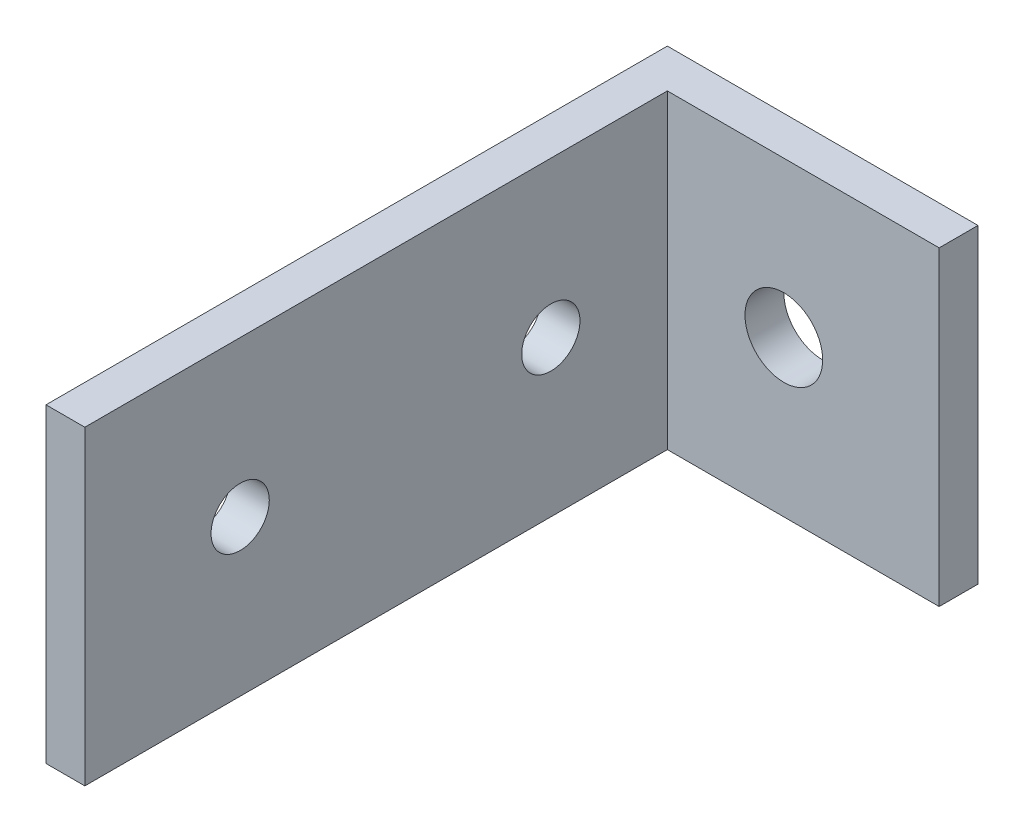
ISO-10303-21;
HEADER;
FILE_DESCRIPTION(('STEP AP214'),'2;1');
FILE_NAME('part.step','',(''),(''),'','','');
FILE_SCHEMA(('AUTOMOTIVE_DESIGN { 1 0 10303 214 1 1 1 1 }'));
ENDSEC;
DATA;
#1=APPLICATION_CONTEXT('core data for automotive mechanical design processes');
#2=APPLICATION_PROTOCOL_DEFINITION('international standard','automotive_design',2000,#1);
#3=PRODUCT_CONTEXT('',#1,'mechanical');
#4=PRODUCT('Part','Part','',(#3));
#5=PRODUCT_RELATED_PRODUCT_CATEGORY('part','',(#4));
#6=PRODUCT_DEFINITION_FORMATION('','',#4);
#7=PRODUCT_DEFINITION_CONTEXT('part definition',#1,'design');
#8=PRODUCT_DEFINITION('design','',#6,#7);
#9=PRODUCT_DEFINITION_SHAPE('','',#8);
#10=(LENGTH_UNIT() NAMED_UNIT(*) SI_UNIT(.MILLI.,.METRE.));
#11=(NAMED_UNIT(*) PLANE_ANGLE_UNIT() SI_UNIT($,.RADIAN.));
#12=(NAMED_UNIT(*) SI_UNIT($,.STERADIAN.) SOLID_ANGLE_UNIT());
#13=UNCERTAINTY_MEASURE_WITH_UNIT(LENGTH_MEASURE(1.E-05),#10,'distance_accuracy_value','');
#14=(GEOMETRIC_REPRESENTATION_CONTEXT(3) GLOBAL_UNCERTAINTY_ASSIGNED_CONTEXT((#13)) GLOBAL_UNIT_ASSIGNED_CONTEXT((#10,
#11,#12)) REPRESENTATION_CONTEXT('',''));
#15=CARTESIAN_POINT('',(0.,0.,0.));
#16=DIRECTION('',(0.,0.,1.));
#17=DIRECTION('',(1.,0.,0.));
#18=AXIS2_PLACEMENT_3D('',#15,#16,#17);
#19=CARTESIAN_POINT('',(22.225,25.4,0.));
#20=DIRECTION('',(-1.,0.,0.));
#21=DIRECTION('',(0.,0.,-1.));
#22=AXIS2_PLACEMENT_3D('',#19,#20,#21);
#23=PLANE('',#22);
#24=DIRECTION('',(0.,0.,1.));
#25=VECTOR('',#24,1.);
#26=CARTESIAN_POINT('',(22.225,0.,0.));
#27=LINE('',#26,#25);
#28=CARTESIAN_POINT('',(22.225,0.,-3.175));
#29=VERTEX_POINT('',#28);
#30=CARTESIAN_POINT('',(22.225,0.,0.));
#31=VERTEX_POINT('',#30);
#32=EDGE_CURVE('E120',#29,#31,#27,.T.);
#33=ORIENTED_EDGE('',*,*,#32,.F.);
#34=DIRECTION('',(0.,-1.,0.));
#35=VECTOR('',#34,1.);
#36=CARTESIAN_POINT('',(22.225,25.4,-3.175));
#37=LINE('',#36,#35);
#38=CARTESIAN_POINT('',(22.225,25.4,-3.175));
#39=VERTEX_POINT('',#38);
#40=EDGE_CURVE('E11',#39,#29,#37,.T.);
#41=ORIENTED_EDGE('',*,*,#40,.F.);
#42=DIRECTION('',(0.,0.,1.));
#43=VECTOR('',#42,1.);
#44=CARTESIAN_POINT('',(22.225,25.4,0.));
#45=LINE('',#44,#43);
#46=CARTESIAN_POINT('',(22.225,25.4,0.));
#47=VERTEX_POINT('',#46);
#48=EDGE_CURVE('E114',#39,#47,#45,.T.);
#49=ORIENTED_EDGE('',*,*,#48,.T.);
#50=DIRECTION('',(0.,-1.,0.));
#51=VECTOR('',#50,1.);
#52=CARTESIAN_POINT('',(22.225,25.4,0.));
#53=LINE('',#52,#51);
#54=EDGE_CURVE('E43',#47,#31,#53,.T.);
#55=ORIENTED_EDGE('',*,*,#54,.T.);
#56=EDGE_LOOP('',(#33,#41,#49,#55));
#57=FACE_BOUND('',#56,.T.);
#58=ADVANCED_FACE('F35',(#57),#23,.F.);
#59=CARTESIAN_POINT('',(0.,25.4,0.));
#60=DIRECTION('',(0.,0.,-1.));
#61=DIRECTION('',(1.,0.,0.));
#62=AXIS2_PLACEMENT_3D('',#59,#60,#61);
#63=PLANE('',#62);
#64=CARTESIAN_POINT('',(9.525,12.7,0.));
#65=DIRECTION('',(0.,0.,-1.));
#66=DIRECTION('',(-1.,0.,0.));
#67=AXIS2_PLACEMENT_3D('',#64,#65,#66);
#68=CIRCLE('',#67,3.175);
#69=CARTESIAN_POINT('',(6.35,12.7,0.));
#70=VERTEX_POINT('',#69);
#71=EDGE_CURVE('E247',#70,#70,#68,.T.);
#72=ORIENTED_EDGE('',*,*,#71,.T.);
#73=EDGE_LOOP('',(#72));
#74=FACE_BOUND('',#73,.T.);
#75=DIRECTION('',(-1.,0.,0.));
#76=VECTOR('',#75,1.);
#77=CARTESIAN_POINT('',(0.,0.,0.));
#78=LINE('',#77,#76);
#79=CARTESIAN_POINT('',(0.,0.,0.));
#80=VERTEX_POINT('',#79);
#81=EDGE_CURVE('E123',#31,#80,#78,.T.);
#82=ORIENTED_EDGE('',*,*,#81,.F.);
#83=ORIENTED_EDGE('',*,*,#54,.F.);
#84=DIRECTION('',(-1.,0.,0.));
#85=VECTOR('',#84,1.);
#86=CARTESIAN_POINT('',(0.,25.4,0.));
#87=LINE('',#86,#85);
#88=CARTESIAN_POINT('',(0.,25.4,0.));
#89=VERTEX_POINT('',#88);
#90=EDGE_CURVE('E112',#47,#89,#87,.T.);
#91=ORIENTED_EDGE('',*,*,#90,.T.);
#92=DIRECTION('',(0.,-1.,0.));
#93=VECTOR('',#92,1.);
#94=CARTESIAN_POINT('',(0.,25.4,0.));
#95=LINE('',#94,#93);
#96=EDGE_CURVE('E106',#89,#80,#95,.T.);
#97=ORIENTED_EDGE('',*,*,#96,.T.);
#98=EDGE_LOOP('',(#82,#83,#91,#97));
#99=FACE_BOUND('',#98,.T.);
#100=ADVANCED_FACE('F158',(#74,#99),#63,.F.);
#101=CARTESIAN_POINT('',(0.,25.4,47.625));
#102=DIRECTION('',(-1.,0.,0.));
#103=DIRECTION('',(0.,0.,-1.));
#104=AXIS2_PLACEMENT_3D('',#101,#102,#103);
#105=PLANE('',#104);
#106=CARTESIAN_POINT('',(0.,12.7,34.925));
#107=DIRECTION('',(1.,0.,0.));
#108=DIRECTION('',(0.,0.,-1.));
#109=AXIS2_PLACEMENT_3D('',#106,#107,#108);
#110=CIRCLE('',#109,2.38125);
#111=CARTESIAN_POINT('',(0.,12.7,32.54375));
#112=VERTEX_POINT('',#111);
#113=EDGE_CURVE('E237',#112,#112,#110,.T.);
#114=ORIENTED_EDGE('',*,*,#113,.F.);
#115=EDGE_LOOP('',(#114));
#116=FACE_BOUND('',#115,.T.);
#117=CARTESIAN_POINT('',(0.,12.7,9.525));
#118=DIRECTION('',(1.,0.,0.));
#119=DIRECTION('',(0.,0.,-1.));
#120=AXIS2_PLACEMENT_3D('',#117,#118,#119);
#121=CIRCLE('',#120,2.38125);
#122=CARTESIAN_POINT('',(0.,12.7,7.14375));
#123=VERTEX_POINT('',#122);
#124=EDGE_CURVE('E241',#123,#123,#121,.T.);
#125=ORIENTED_EDGE('',*,*,#124,.F.);
#126=EDGE_LOOP('',(#125));
#127=FACE_BOUND('',#126,.T.);
#128=DIRECTION('',(0.,0.,1.));
#129=VECTOR('',#128,1.);
#130=CARTESIAN_POINT('',(0.,0.,47.625));
#131=LINE('',#130,#129);
#132=CARTESIAN_POINT('',(0.,0.,47.625));
#133=VERTEX_POINT('',#132);
#134=EDGE_CURVE('E127',#80,#133,#131,.T.);
#135=ORIENTED_EDGE('',*,*,#134,.F.);
#136=ORIENTED_EDGE('',*,*,#96,.F.);
#137=DIRECTION('',(0.,0.,1.));
#138=VECTOR('',#137,1.);
#139=CARTESIAN_POINT('',(0.,25.4,47.625));
#140=LINE('',#139,#138);
#141=CARTESIAN_POINT('',(0.,25.4,47.625));
#142=VERTEX_POINT('',#141);
#143=EDGE_CURVE('E93',#89,#142,#140,.T.);
#144=ORIENTED_EDGE('',*,*,#143,.T.);
#145=DIRECTION('',(0.,-1.,0.));
#146=VECTOR('',#145,1.);
#147=CARTESIAN_POINT('',(0.,25.4,47.625));
#148=LINE('',#147,#146);
#149=EDGE_CURVE('E100',#142,#133,#148,.T.);
#150=ORIENTED_EDGE('',*,*,#149,.T.);
#151=EDGE_LOOP('',(#135,#136,#144,#150));
#152=FACE_BOUND('',#151,.T.);
#153=ADVANCED_FACE('F109',(#116,#127,#152),#105,.F.);
#154=CARTESIAN_POINT('',(-3.175,25.4,47.625));
#155=DIRECTION('',(0.,0.,-1.));
#156=DIRECTION('',(1.,0.,0.));
#157=AXIS2_PLACEMENT_3D('',#154,#155,#156);
#158=PLANE('',#157);
#159=DIRECTION('',(-1.,0.,0.));
#160=VECTOR('',#159,1.);
#161=CARTESIAN_POINT('',(-3.175,0.,47.625));
#162=LINE('',#161,#160);
#163=CARTESIAN_POINT('',(-3.175,0.,47.625));
#164=VERTEX_POINT('',#163);
#165=EDGE_CURVE('E103',#133,#164,#162,.T.);
#166=ORIENTED_EDGE('',*,*,#165,.F.);
#167=ORIENTED_EDGE('',*,*,#149,.F.);
#168=DIRECTION('',(-1.,0.,0.));
#169=VECTOR('',#168,1.);
#170=CARTESIAN_POINT('',(-3.175,25.4,47.625));
#171=LINE('',#170,#169);
#172=CARTESIAN_POINT('',(-3.175,25.4,47.625));
#173=VERTEX_POINT('',#172);
#174=EDGE_CURVE('E89',#142,#173,#171,.T.);
#175=ORIENTED_EDGE('',*,*,#174,.T.);
#176=DIRECTION('',(0.,-1.,0.));
#177=VECTOR('',#176,1.);
#178=CARTESIAN_POINT('',(-3.175,25.4,47.625));
#179=LINE('',#178,#177);
#180=EDGE_CURVE('E107',#173,#164,#179,.T.);
#181=ORIENTED_EDGE('',*,*,#180,.T.);
#182=EDGE_LOOP('',(#166,#167,#175,#181));
#183=FACE_BOUND('',#182,.T.);
#184=ADVANCED_FACE('F101',(#183),#158,.F.);
#185=CARTESIAN_POINT('',(-3.175,25.4,47.625));
#186=DIRECTION('',(1.,0.,0.));
#187=DIRECTION('',(0.,0.,1.));
#188=AXIS2_PLACEMENT_3D('',#185,#186,#187);
#189=PLANE('',#188);
#190=CARTESIAN_POINT('',(-3.175,12.7,34.925));
#191=DIRECTION('',(1.,0.,0.));
#192=DIRECTION('',(0.,0.,-1.));
#193=AXIS2_PLACEMENT_3D('',#190,#191,#192);
#194=CIRCLE('',#193,2.38125);
#195=CARTESIAN_POINT('',(-3.175,12.7,32.54375));
#196=VERTEX_POINT('',#195);
#197=EDGE_CURVE('E234',#196,#196,#194,.T.);
#198=ORIENTED_EDGE('',*,*,#197,.T.);
#199=EDGE_LOOP('',(#198));
#200=FACE_BOUND('',#199,.T.);
#201=CARTESIAN_POINT('',(-3.175,12.7,9.525));
#202=DIRECTION('',(1.,0.,0.));
#203=DIRECTION('',(0.,0.,-1.));
#204=AXIS2_PLACEMENT_3D('',#201,#202,#203);
#205=CIRCLE('',#204,2.38125);
#206=CARTESIAN_POINT('',(-3.17499999999999,12.7,7.14375));
#207=VERTEX_POINT('',#206);
#208=EDGE_CURVE('E238',#207,#207,#205,.T.);
#209=ORIENTED_EDGE('',*,*,#208,.T.);
#210=EDGE_LOOP('',(#209));
#211=FACE_BOUND('',#210,.T.);
#212=DIRECTION('',(0.,0.,-1.));
#213=VECTOR('',#212,1.);
#214=CARTESIAN_POINT('',(-3.175,0.,47.625));
#215=LINE('',#214,#213);
#216=CARTESIAN_POINT('',(-3.17499999999999,0.,-3.175));
#217=VERTEX_POINT('',#216);
#218=EDGE_CURVE('E74',#164,#217,#215,.T.);
#219=ORIENTED_EDGE('',*,*,#218,.F.);
#220=ORIENTED_EDGE('',*,*,#180,.F.);
#221=DIRECTION('',(0.,0.,-1.));
#222=VECTOR('',#221,1.);
#223=CARTESIAN_POINT('',(-3.175,25.4,47.625));
#224=LINE('',#223,#222);
#225=CARTESIAN_POINT('',(-3.17499999999999,25.4,-3.175));
#226=VERTEX_POINT('',#225);
#227=EDGE_CURVE('E96',#173,#226,#224,.T.);
#228=ORIENTED_EDGE('',*,*,#227,.T.);
#229=DIRECTION('',(0.,-1.,0.));
#230=VECTOR('',#229,1.);
#231=CARTESIAN_POINT('',(-3.17499999999999,25.4,-3.175));
#232=LINE('',#231,#230);
#233=EDGE_CURVE('E119',#226,#217,#232,.T.);
#234=ORIENTED_EDGE('',*,*,#233,.T.);
#235=EDGE_LOOP('',(#219,#220,#228,#234));
#236=FACE_BOUND('',#235,.T.);
#237=ADVANCED_FACE('F145',(#200,#211,#236),#189,.F.);
#238=CARTESIAN_POINT('',(-3.17499999999999,25.4,-3.175));
#239=DIRECTION('',(0.,0.,1.));
#240=DIRECTION('',(-1.,0.,0.));
#241=AXIS2_PLACEMENT_3D('',#238,#239,#240);
#242=PLANE('',#241);
#243=CARTESIAN_POINT('',(9.525,12.7,-3.175));
#244=DIRECTION('',(0.,0.,-1.));
#245=DIRECTION('',(-1.,0.,0.));
#246=AXIS2_PLACEMENT_3D('',#243,#244,#245);
#247=CIRCLE('',#246,3.175);
#248=CARTESIAN_POINT('',(6.35,12.7,-3.175));
#249=VERTEX_POINT('',#248);
#250=EDGE_CURVE('E124',#249,#249,#247,.T.);
#251=ORIENTED_EDGE('',*,*,#250,.F.);
#252=EDGE_LOOP('',(#251));
#253=FACE_BOUND('',#252,.T.);
#254=DIRECTION('',(1.,0.,0.));
#255=VECTOR('',#254,1.);
#256=CARTESIAN_POINT('',(-3.17499999999999,0.,-3.175));
#257=LINE('',#256,#255);
#258=EDGE_CURVE('E79',#217,#29,#257,.T.);
#259=ORIENTED_EDGE('',*,*,#258,.F.);
#260=ORIENTED_EDGE('',*,*,#233,.F.);
#261=DIRECTION('',(1.,0.,0.));
#262=VECTOR('',#261,1.);
#263=CARTESIAN_POINT('',(4.25962732919255,25.4,-3.175));
#264=LINE('',#263,#262);
#265=EDGE_CURVE('E51',#226,#39,#264,.T.);
#266=ORIENTED_EDGE('',*,*,#265,.T.);
#267=ORIENTED_EDGE('',*,*,#40,.T.);
#268=EDGE_LOOP('',(#259,#260,#266,#267));
#269=FACE_BOUND('',#268,.T.);
#270=ADVANCED_FACE('F143',(#253,#269),#242,.F.);
#271=CARTESIAN_POINT('',(0.,25.4,0.));
#272=DIRECTION('',(0.,-1.,0.));
#273=DIRECTION('',(0.,0.,1.));
#274=AXIS2_PLACEMENT_3D('',#271,#272,#273);
#275=PLANE('',#274);
#276=ORIENTED_EDGE('',*,*,#265,.F.);
#277=ORIENTED_EDGE('',*,*,#227,.F.);
#278=ORIENTED_EDGE('',*,*,#174,.F.);
#279=ORIENTED_EDGE('',*,*,#143,.F.);
#280=ORIENTED_EDGE('',*,*,#90,.F.);
#281=ORIENTED_EDGE('',*,*,#48,.F.);
#282=EDGE_LOOP('',(#276,#277,#278,#279,#280,#281));
#283=FACE_BOUND('',#282,.T.);
#284=ADVANCED_FACE('F91',(#283),#275,.F.);
#285=CARTESIAN_POINT('',(0.,0.,0.));
#286=DIRECTION('',(0.,-1.,0.));
#287=DIRECTION('',(0.,0.,1.));
#288=AXIS2_PLACEMENT_3D('',#285,#286,#287);
#289=PLANE('',#288);
#290=ORIENTED_EDGE('',*,*,#32,.T.);
#291=ORIENTED_EDGE('',*,*,#81,.T.);
#292=ORIENTED_EDGE('',*,*,#134,.T.);
#293=ORIENTED_EDGE('',*,*,#165,.T.);
#294=ORIENTED_EDGE('',*,*,#218,.T.);
#295=ORIENTED_EDGE('',*,*,#258,.T.);
#296=EDGE_LOOP('',(#290,#291,#292,#293,#294,#295));
#297=FACE_BOUND('',#296,.T.);
#298=ADVANCED_FACE('F142',(#297),#289,.T.);
#299=CARTESIAN_POINT('',(9.525,12.7,-3.175));
#300=DIRECTION('',(0.,0.,1.));
#301=DIRECTION('',(-1.,0.,0.));
#302=AXIS2_PLACEMENT_3D('',#299,#300,#301);
#303=CYLINDRICAL_SURFACE('',#302,3.175);
#304=ORIENTED_EDGE('',*,*,#250,.T.);
#305=EDGE_LOOP('',(#304));
#306=FACE_BOUND('',#305,.T.);
#307=ORIENTED_EDGE('',*,*,#71,.F.);
#308=EDGE_LOOP('',(#307));
#309=FACE_BOUND('',#308,.T.);
#310=ADVANCED_FACE('F199',(#306,#309),#303,.F.);
#311=CARTESIAN_POINT('',(22.225,12.7,9.525));
#312=DIRECTION('',(-1.,0.,0.));
#313=DIRECTION('',(0.,0.,-1.));
#314=AXIS2_PLACEMENT_3D('',#311,#312,#313);
#315=CYLINDRICAL_SURFACE('',#314,2.38125);
#316=ORIENTED_EDGE('',*,*,#208,.F.);
#317=EDGE_LOOP('',(#316));
#318=FACE_BOUND('',#317,.T.);
#319=ORIENTED_EDGE('',*,*,#124,.T.);
#320=EDGE_LOOP('',(#319));
#321=FACE_BOUND('',#320,.T.);
#322=ADVANCED_FACE('F207',(#318,#321),#315,.F.);
#323=CARTESIAN_POINT('',(22.225,12.7,34.925));
#324=DIRECTION('',(-1.,0.,0.));
#325=DIRECTION('',(0.,0.,-1.));
#326=AXIS2_PLACEMENT_3D('',#323,#324,#325);
#327=CYLINDRICAL_SURFACE('',#326,2.38125);
#328=ORIENTED_EDGE('',*,*,#197,.F.);
#329=EDGE_LOOP('',(#328));
#330=FACE_BOUND('',#329,.T.);
#331=ORIENTED_EDGE('',*,*,#113,.T.);
#332=EDGE_LOOP('',(#331));
#333=FACE_BOUND('',#332,.T.);
#334=ADVANCED_FACE('F217',(#330,#333),#327,.F.);
#335=CLOSED_SHELL('',(#58,#100,#153,#184,#237,#270,#284,#298,#310,#322,#334));
#336=MANIFOLD_SOLID_BREP('B2',#335);
#337=ADVANCED_BREP_SHAPE_REPRESENTATION('',(#18,#336),#14);
#338=SHAPE_DEFINITION_REPRESENTATION(#9,#337);
ENDSEC;
END-ISO-10303-21;
